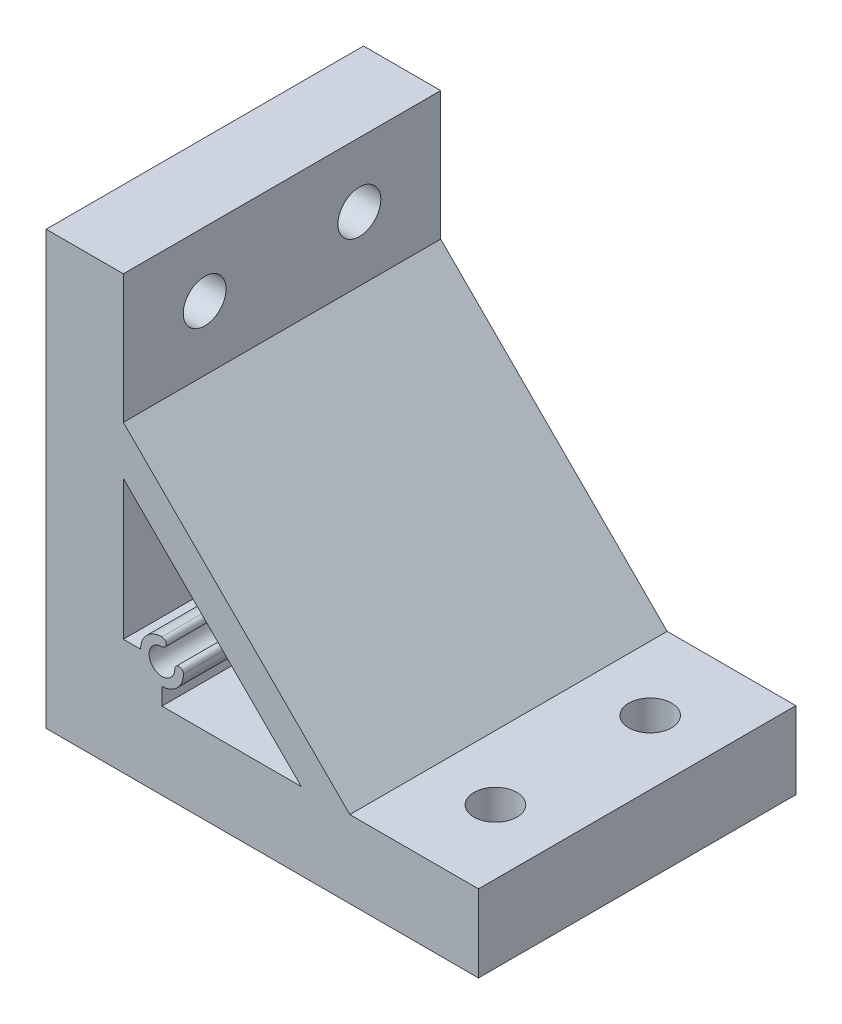
ISO-10303-21;
HEADER;
FILE_DESCRIPTION(('STEP AP214'),'2;1');
FILE_NAME('part.step','',(''),(''),'','','');
FILE_SCHEMA(('AUTOMOTIVE_DESIGN { 1 0 10303 214 1 1 1 1 }'));
ENDSEC;
DATA;
#1=APPLICATION_CONTEXT('core data for automotive mechanical design processes');
#2=APPLICATION_PROTOCOL_DEFINITION('international standard','automotive_design',2000,#1);
#3=PRODUCT_CONTEXT('',#1,'mechanical');
#4=PRODUCT('Part','Part','',(#3));
#5=PRODUCT_RELATED_PRODUCT_CATEGORY('part','',(#4));
#6=PRODUCT_DEFINITION_FORMATION('','',#4);
#7=PRODUCT_DEFINITION_CONTEXT('part definition',#1,'design');
#8=PRODUCT_DEFINITION('design','',#6,#7);
#9=PRODUCT_DEFINITION_SHAPE('','',#8);
#10=(LENGTH_UNIT() NAMED_UNIT(*) SI_UNIT(.MILLI.,.METRE.));
#11=(NAMED_UNIT(*) PLANE_ANGLE_UNIT() SI_UNIT($,.RADIAN.));
#12=(NAMED_UNIT(*) SI_UNIT($,.STERADIAN.) SOLID_ANGLE_UNIT());
#13=UNCERTAINTY_MEASURE_WITH_UNIT(LENGTH_MEASURE(1.E-05),#10,'distance_accuracy_value','');
#14=(GEOMETRIC_REPRESENTATION_CONTEXT(3) GLOBAL_UNCERTAINTY_ASSIGNED_CONTEXT((#13)) GLOBAL_UNIT_ASSIGNED_CONTEXT((#10,
#11,#12)) REPRESENTATION_CONTEXT('',''));
#15=CARTESIAN_POINT('',(0.,0.,0.));
#16=DIRECTION('',(0.,0.,1.));
#17=DIRECTION('',(1.,0.,0.));
#18=AXIS2_PLACEMENT_3D('',#15,#16,#17);
#19=CARTESIAN_POINT('',(0.,0.,37.));
#20=DIRECTION('',(-1.,0.,0.));
#21=DIRECTION('',(0.,0.,1.));
#22=AXIS2_PLACEMENT_3D('',#19,#20,#21);
#23=PLANE('',#22);
#24=CARTESIAN_POINT('',(0.,42.9020003333889,27.517));
#25=DIRECTION('',(-1.,0.,0.));
#26=DIRECTION('',(0.,0.,1.));
#27=AXIS2_PLACEMENT_3D('',#24,#25,#26);
#28=CIRCLE('',#27,2.5);
#29=CARTESIAN_POINT('',(0.,42.9020003333889,30.017));
#30=VERTEX_POINT('',#29);
#31=EDGE_CURVE('E287',#30,#30,#28,.F.);
#32=ORIENTED_EDGE('',*,*,#31,.T.);
#33=EDGE_LOOP('',(#32));
#34=FACE_BOUND('',#33,.T.);
#35=CARTESIAN_POINT('',(0.,42.9020003333889,9.483));
#36=DIRECTION('',(-1.,0.,0.));
#37=DIRECTION('',(0.,0.,1.));
#38=AXIS2_PLACEMENT_3D('',#35,#36,#37);
#39=CIRCLE('',#38,2.5);
#40=CARTESIAN_POINT('',(0.,42.9020003333889,11.983));
#41=VERTEX_POINT('',#40);
#42=EDGE_CURVE('E414',#41,#41,#39,.F.);
#43=ORIENTED_EDGE('',*,*,#42,.T.);
#44=EDGE_LOOP('',(#43));
#45=FACE_BOUND('',#44,.T.);
#46=DIRECTION('',(0.,1.,0.));
#47=VECTOR('',#46,1.);
#48=CARTESIAN_POINT('',(0.,0.,0.));
#49=LINE('',#48,#47);
#50=CARTESIAN_POINT('',(0.,0.,0.));
#51=VERTEX_POINT('',#50);
#52=CARTESIAN_POINT('',(0.,50.4020003333889,0.));
#53=VERTEX_POINT('',#52);
#54=EDGE_CURVE('E218',#51,#53,#49,.T.);
#55=ORIENTED_EDGE('',*,*,#54,.F.);
#56=DIRECTION('',(0.,0.,-1.));
#57=VECTOR('',#56,1.);
#58=CARTESIAN_POINT('',(0.,0.,37.));
#59=LINE('',#58,#57);
#60=CARTESIAN_POINT('',(0.,0.,37.));
#61=VERTEX_POINT('',#60);
#62=EDGE_CURVE('E12',#61,#51,#59,.T.);
#63=ORIENTED_EDGE('',*,*,#62,.F.);
#64=DIRECTION('',(0.,1.,0.));
#65=VECTOR('',#64,1.);
#66=CARTESIAN_POINT('',(0.,0.,37.));
#67=LINE('',#66,#65);
#68=CARTESIAN_POINT('',(0.,50.4020003333889,37.));
#69=VERTEX_POINT('',#68);
#70=EDGE_CURVE('E304',#61,#69,#67,.T.);
#71=ORIENTED_EDGE('',*,*,#70,.T.);
#72=DIRECTION('',(0.,0.,-1.));
#73=VECTOR('',#72,1.);
#74=CARTESIAN_POINT('',(0.,50.4020003333889,37.));
#75=LINE('',#74,#73);
#76=EDGE_CURVE('E98',#69,#53,#75,.T.);
#77=ORIENTED_EDGE('',*,*,#76,.T.);
#78=EDGE_LOOP('',(#55,#63,#71,#77));
#79=FACE_BOUND('',#78,.T.);
#80=ADVANCED_FACE('F79',(#34,#45,#79),#23,.T.);
#81=CARTESIAN_POINT('',(0.,0.,37.));
#82=DIRECTION('',(0.,1.,0.));
#83=DIRECTION('',(0.,0.,1.));
#84=AXIS2_PLACEMENT_3D('',#81,#82,#83);
#85=PLANE('',#84);
#86=CARTESIAN_POINT('',(42.9020003333889,0.,27.517));
#87=DIRECTION('',(0.,1.,0.));
#88=DIRECTION('',(0.,0.,1.));
#89=AXIS2_PLACEMENT_3D('',#86,#87,#88);
#90=CIRCLE('',#89,2.5);
#91=CARTESIAN_POINT('',(42.9020003333889,0.,30.017));
#92=VERTEX_POINT('',#91);
#93=EDGE_CURVE('E460',#92,#92,#90,.T.);
#94=ORIENTED_EDGE('',*,*,#93,.T.);
#95=EDGE_LOOP('',(#94));
#96=FACE_BOUND('',#95,.T.);
#97=CARTESIAN_POINT('',(42.9020003333889,0.,9.483));
#98=DIRECTION('',(0.,1.,0.));
#99=DIRECTION('',(0.,0.,1.));
#100=AXIS2_PLACEMENT_3D('',#97,#98,#99);
#101=CIRCLE('',#100,2.5);
#102=CARTESIAN_POINT('',(42.9020003333889,0.,11.983));
#103=VERTEX_POINT('',#102);
#104=EDGE_CURVE('E465',#103,#103,#101,.T.);
#105=ORIENTED_EDGE('',*,*,#104,.T.);
#106=EDGE_LOOP('',(#105));
#107=FACE_BOUND('',#106,.T.);
#108=DIRECTION('',(1.,0.,0.));
#109=VECTOR('',#108,1.);
#110=CARTESIAN_POINT('',(0.,0.,0.));
#111=LINE('',#110,#109);
#112=CARTESIAN_POINT('',(50.4020003333889,0.,0.));
#113=VERTEX_POINT('',#112);
#114=EDGE_CURVE('E220',#51,#113,#111,.T.);
#115=ORIENTED_EDGE('',*,*,#114,.T.);
#116=DIRECTION('',(0.,0.,-1.));
#117=VECTOR('',#116,1.);
#118=CARTESIAN_POINT('',(50.4020003333889,0.,37.));
#119=LINE('',#118,#117);
#120=CARTESIAN_POINT('',(50.4020003333889,0.,37.));
#121=VERTEX_POINT('',#120);
#122=EDGE_CURVE('E89',#121,#113,#119,.T.);
#123=ORIENTED_EDGE('',*,*,#122,.F.);
#124=DIRECTION('',(1.,0.,0.));
#125=VECTOR('',#124,1.);
#126=CARTESIAN_POINT('',(0.,0.,37.));
#127=LINE('',#126,#125);
#128=EDGE_CURVE('E306',#61,#121,#127,.T.);
#129=ORIENTED_EDGE('',*,*,#128,.F.);
#130=ORIENTED_EDGE('',*,*,#62,.T.);
#131=EDGE_LOOP('',(#115,#123,#129,#130));
#132=FACE_BOUND('',#131,.T.);
#133=ADVANCED_FACE('F335',(#96,#107,#132),#85,.F.);
#134=CARTESIAN_POINT('',(50.4020003333889,0.,37.));
#135=DIRECTION('',(-1.,0.,0.));
#136=DIRECTION('',(0.,0.,1.));
#137=AXIS2_PLACEMENT_3D('',#134,#135,#136);
#138=PLANE('',#137);
#139=DIRECTION('',(0.,1.,0.));
#140=VECTOR('',#139,1.);
#141=CARTESIAN_POINT('',(50.4020003333889,0.,0.));
#142=LINE('',#141,#140);
#143=CARTESIAN_POINT('',(50.4020003333889,9.,0.));
#144=VERTEX_POINT('',#143);
#145=EDGE_CURVE('E223',#113,#144,#142,.T.);
#146=ORIENTED_EDGE('',*,*,#145,.T.);
#147=DIRECTION('',(0.,0.,-1.));
#148=VECTOR('',#147,1.);
#149=CARTESIAN_POINT('',(50.4020003333889,9.,37.));
#150=LINE('',#149,#148);
#151=CARTESIAN_POINT('',(50.4020003333889,9.,37.));
#152=VERTEX_POINT('',#151);
#153=EDGE_CURVE('E239',#152,#144,#150,.T.);
#154=ORIENTED_EDGE('',*,*,#153,.F.);
#155=DIRECTION('',(0.,1.,0.));
#156=VECTOR('',#155,1.);
#157=CARTESIAN_POINT('',(50.4020003333889,0.,37.));
#158=LINE('',#157,#156);
#159=EDGE_CURVE('E309',#121,#152,#158,.T.);
#160=ORIENTED_EDGE('',*,*,#159,.F.);
#161=ORIENTED_EDGE('',*,*,#122,.T.);
#162=EDGE_LOOP('',(#146,#154,#160,#161));
#163=FACE_BOUND('',#162,.T.);
#164=ADVANCED_FACE('F314',(#163),#138,.F.);
#165=CARTESIAN_POINT('',(0.,9.,37.));
#166=DIRECTION('',(0.,-1.,0.));
#167=DIRECTION('',(0.,0.,-1.));
#168=AXIS2_PLACEMENT_3D('',#165,#166,#167);
#169=PLANE('',#168);
#170=CARTESIAN_POINT('',(42.902000333389,8.99999999999985,27.517));
#171=DIRECTION('',(0.,-1.,0.));
#172=DIRECTION('',(1.,0.,0.));
#173=AXIS2_PLACEMENT_3D('',#170,#171,#172);
#174=CIRCLE('',#173,2.5);
#175=CARTESIAN_POINT('',(45.402000333389,8.99999999999984,27.517));
#176=VERTEX_POINT('',#175);
#177=EDGE_CURVE('E457',#176,#176,#174,.T.);
#178=ORIENTED_EDGE('',*,*,#177,.T.);
#179=EDGE_LOOP('',(#178));
#180=FACE_BOUND('',#179,.T.);
#181=CARTESIAN_POINT('',(42.902000333389,8.99999999999985,9.483));
#182=DIRECTION('',(0.,-1.,0.));
#183=DIRECTION('',(1.,0.,0.));
#184=AXIS2_PLACEMENT_3D('',#181,#182,#183);
#185=CIRCLE('',#184,2.5);
#186=CARTESIAN_POINT('',(45.402000333389,8.99999999999984,9.483));
#187=VERTEX_POINT('',#186);
#188=EDGE_CURVE('E461',#187,#187,#185,.T.);
#189=ORIENTED_EDGE('',*,*,#188,.T.);
#190=EDGE_LOOP('',(#189));
#191=FACE_BOUND('',#190,.T.);
#192=DIRECTION('',(-1.,0.,0.));
#193=VECTOR('',#192,1.);
#194=CARTESIAN_POINT('',(0.,9.,0.));
#195=LINE('',#194,#193);
#196=CARTESIAN_POINT('',(35.4020003333889,9.,0.));
#197=VERTEX_POINT('',#196);
#198=EDGE_CURVE('E226',#144,#197,#195,.T.);
#199=ORIENTED_EDGE('',*,*,#198,.T.);
#200=DIRECTION('',(0.,0.,-1.));
#201=VECTOR('',#200,1.);
#202=CARTESIAN_POINT('',(35.4020003333889,9.,37.));
#203=LINE('',#202,#201);
#204=CARTESIAN_POINT('',(35.4020003333889,9.,37.));
#205=VERTEX_POINT('',#204);
#206=EDGE_CURVE('E185',#205,#197,#203,.T.);
#207=ORIENTED_EDGE('',*,*,#206,.F.);
#208=DIRECTION('',(-1.,0.,0.));
#209=VECTOR('',#208,1.);
#210=CARTESIAN_POINT('',(0.,9.,37.));
#211=LINE('',#210,#209);
#212=EDGE_CURVE('E194',#152,#205,#211,.T.);
#213=ORIENTED_EDGE('',*,*,#212,.F.);
#214=ORIENTED_EDGE('',*,*,#153,.T.);
#215=EDGE_LOOP('',(#199,#207,#213,#214));
#216=FACE_BOUND('',#215,.T.);
#217=ADVANCED_FACE('F316',(#180,#191,#216),#169,.F.);
#218=CARTESIAN_POINT('',(22.2010001666945,22.2010001666945,37.));
#219=DIRECTION('',(0.707106781186547,0.707106781186547,0.));
#220=DIRECTION('',(-0.707106781186548,0.707106781186548,0.));
#221=AXIS2_PLACEMENT_3D('',#218,#219,#220);
#222=PLANE('',#221);
#223=DIRECTION('',(0.707106781186548,-0.707106781186548,0.));
#224=VECTOR('',#223,1.);
#225=CARTESIAN_POINT('',(22.2010001666945,22.2010001666945,0.));
#226=LINE('',#225,#224);
#227=CARTESIAN_POINT('',(9.,35.4020003333889,0.));
#228=VERTEX_POINT('',#227);
#229=EDGE_CURVE('E181',#228,#197,#226,.T.);
#230=ORIENTED_EDGE('',*,*,#229,.F.);
#231=DIRECTION('',(0.,0.,-1.));
#232=VECTOR('',#231,1.);
#233=CARTESIAN_POINT('',(9.,35.4020003333889,37.));
#234=LINE('',#233,#232);
#235=CARTESIAN_POINT('',(9.,35.4020003333889,37.));
#236=VERTEX_POINT('',#235);
#237=EDGE_CURVE('E176',#236,#228,#234,.T.);
#238=ORIENTED_EDGE('',*,*,#237,.F.);
#239=DIRECTION('',(0.707106781186548,-0.707106781186548,0.));
#240=VECTOR('',#239,1.);
#241=CARTESIAN_POINT('',(22.2010001666945,22.2010001666945,37.));
#242=LINE('',#241,#240);
#243=EDGE_CURVE('E179',#236,#205,#242,.T.);
#244=ORIENTED_EDGE('',*,*,#243,.T.);
#245=ORIENTED_EDGE('',*,*,#206,.T.);
#246=EDGE_LOOP('',(#230,#238,#244,#245));
#247=FACE_BOUND('',#246,.T.);
#248=ADVANCED_FACE('F178',(#247),#222,.T.);
#249=CARTESIAN_POINT('',(9.00000000000001,0.,37.));
#250=DIRECTION('',(1.,0.,0.));
#251=DIRECTION('',(0.,1.,0.));
#252=AXIS2_PLACEMENT_3D('',#249,#250,#251);
#253=PLANE('',#252);
#254=CARTESIAN_POINT('',(9.,42.9020003333889,27.517));
#255=DIRECTION('',(1.,0.,0.));
#256=DIRECTION('',(0.,1.,0.));
#257=AXIS2_PLACEMENT_3D('',#254,#255,#256);
#258=CIRCLE('',#257,2.5);
#259=CARTESIAN_POINT('',(9.,45.4020003333889,27.517));
#260=VERTEX_POINT('',#259);
#261=EDGE_CURVE('E282',#260,#260,#258,.T.);
#262=ORIENTED_EDGE('',*,*,#261,.F.);
#263=EDGE_LOOP('',(#262));
#264=FACE_BOUND('',#263,.T.);
#265=CARTESIAN_POINT('',(9.,42.9020003333889,9.483));
#266=DIRECTION('',(1.,0.,0.));
#267=DIRECTION('',(0.,1.,0.));
#268=AXIS2_PLACEMENT_3D('',#265,#266,#267);
#269=CIRCLE('',#268,2.5);
#270=CARTESIAN_POINT('',(9.,45.4020003333889,9.483));
#271=VERTEX_POINT('',#270);
#272=EDGE_CURVE('E470',#271,#271,#269,.T.);
#273=ORIENTED_EDGE('',*,*,#272,.F.);
#274=EDGE_LOOP('',(#273));
#275=FACE_BOUND('',#274,.T.);
#276=DIRECTION('',(0.,-1.,0.));
#277=VECTOR('',#276,1.);
#278=CARTESIAN_POINT('',(9.00000000000001,0.,0.));
#279=LINE('',#278,#277);
#280=CARTESIAN_POINT('',(9.,50.4020003333889,0.));
#281=VERTEX_POINT('',#280);
#282=EDGE_CURVE('E230',#281,#228,#279,.T.);
#283=ORIENTED_EDGE('',*,*,#282,.F.);
#284=DIRECTION('',(0.,0.,-1.));
#285=VECTOR('',#284,1.);
#286=CARTESIAN_POINT('',(9.,50.4020003333889,37.));
#287=LINE('',#286,#285);
#288=CARTESIAN_POINT('',(9.,50.4020003333889,37.));
#289=VERTEX_POINT('',#288);
#290=EDGE_CURVE('E136',#289,#281,#287,.T.);
#291=ORIENTED_EDGE('',*,*,#290,.F.);
#292=DIRECTION('',(0.,-1.,0.));
#293=VECTOR('',#292,1.);
#294=CARTESIAN_POINT('',(9.00000000000001,0.,37.));
#295=LINE('',#294,#293);
#296=EDGE_CURVE('E192',#289,#236,#295,.T.);
#297=ORIENTED_EDGE('',*,*,#296,.T.);
#298=ORIENTED_EDGE('',*,*,#237,.T.);
#299=EDGE_LOOP('',(#283,#291,#297,#298));
#300=FACE_BOUND('',#299,.T.);
#301=ADVANCED_FACE('F197',(#264,#275,#300),#253,.T.);
#302=CARTESIAN_POINT('',(13.5,0.,37.));
#303=DIRECTION('',(-1.,0.,0.));
#304=DIRECTION('',(0.,0.,1.));
#305=AXIS2_PLACEMENT_3D('',#302,#303,#304);
#306=PLANE('',#305);
#307=DIRECTION('',(0.,1.,0.));
#308=VECTOR('',#307,1.);
#309=CARTESIAN_POINT('',(13.5,0.,0.));
#310=LINE('',#309,#308);
#311=CARTESIAN_POINT('',(13.5,9.,0.));
#312=VERTEX_POINT('',#311);
#313=CARTESIAN_POINT('',(13.5,11.,0.));
#314=VERTEX_POINT('',#313);
#315=EDGE_CURVE('E204',#312,#314,#310,.T.);
#316=ORIENTED_EDGE('',*,*,#315,.T.);
#317=DIRECTION('',(0.,0.,-1.));
#318=VECTOR('',#317,1.);
#319=CARTESIAN_POINT('',(13.5,11.,37.));
#320=LINE('',#319,#318);
#321=CARTESIAN_POINT('',(13.5,11.,37.));
#322=VERTEX_POINT('',#321);
#323=EDGE_CURVE('E83',#322,#314,#320,.T.);
#324=ORIENTED_EDGE('',*,*,#323,.F.);
#325=DIRECTION('',(0.,1.,0.));
#326=VECTOR('',#325,1.);
#327=CARTESIAN_POINT('',(13.5,0.,37.));
#328=LINE('',#327,#326);
#329=CARTESIAN_POINT('',(13.5,9.,37.));
#330=VERTEX_POINT('',#329);
#331=EDGE_CURVE('E235',#330,#322,#328,.T.);
#332=ORIENTED_EDGE('',*,*,#331,.F.);
#333=DIRECTION('',(0.,0.,-1.));
#334=VECTOR('',#333,1.);
#335=CARTESIAN_POINT('',(13.5,9.,37.));
#336=LINE('',#335,#334);
#337=EDGE_CURVE('E200',#330,#312,#336,.T.);
#338=ORIENTED_EDGE('',*,*,#337,.T.);
#339=EDGE_LOOP('',(#316,#324,#332,#338));
#340=FACE_BOUND('',#339,.T.);
#341=ADVANCED_FACE('F81',(#340),#306,.F.);
#342=CARTESIAN_POINT('',(0.,13.5,37.));
#343=DIRECTION('',(0.,1.,0.));
#344=DIRECTION('',(0.,0.,1.));
#345=AXIS2_PLACEMENT_3D('',#342,#343,#344);
#346=PLANE('',#345);
#347=DIRECTION('',(1.,0.,0.));
#348=VECTOR('',#347,1.);
#349=CARTESIAN_POINT('',(0.,13.5,0.));
#350=LINE('',#349,#348);
#351=CARTESIAN_POINT('',(9.,13.5,0.));
#352=VERTEX_POINT('',#351);
#353=CARTESIAN_POINT('',(11.,13.5,0.));
#354=VERTEX_POINT('',#353);
#355=EDGE_CURVE('E207',#352,#354,#350,.T.);
#356=ORIENTED_EDGE('',*,*,#355,.F.);
#357=DIRECTION('',(0.,0.,-1.));
#358=VECTOR('',#357,1.);
#359=CARTESIAN_POINT('',(9.,13.5,37.));
#360=LINE('',#359,#358);
#361=CARTESIAN_POINT('',(9.,13.5,37.));
#362=VERTEX_POINT('',#361);
#363=EDGE_CURVE('E148',#362,#352,#360,.T.);
#364=ORIENTED_EDGE('',*,*,#363,.F.);
#365=DIRECTION('',(1.,0.,0.));
#366=VECTOR('',#365,1.);
#367=CARTESIAN_POINT('',(0.,13.5,37.));
#368=LINE('',#367,#366);
#369=CARTESIAN_POINT('',(11.,13.5,37.));
#370=VERTEX_POINT('',#369);
#371=EDGE_CURVE('E295',#362,#370,#368,.T.);
#372=ORIENTED_EDGE('',*,*,#371,.T.);
#373=DIRECTION('',(0.,0.,-1.));
#374=VECTOR('',#373,1.);
#375=CARTESIAN_POINT('',(11.,13.5,37.));
#376=LINE('',#375,#374);
#377=EDGE_CURVE('E251',#370,#354,#376,.T.);
#378=ORIENTED_EDGE('',*,*,#377,.T.);
#379=EDGE_LOOP('',(#356,#364,#372,#378));
#380=FACE_BOUND('',#379,.T.);
#381=ADVANCED_FACE('F354',(#380),#346,.T.);
#382=CARTESIAN_POINT('',(9.,0.,37.));
#383=DIRECTION('',(1.,0.,0.));
#384=DIRECTION('',(0.,1.,0.));
#385=AXIS2_PLACEMENT_3D('',#382,#383,#384);
#386=PLANE('',#385);
#387=DIRECTION('',(0.,-1.,0.));
#388=VECTOR('',#387,1.);
#389=CARTESIAN_POINT('',(9.,0.,0.));
#390=LINE('',#389,#388);
#391=CARTESIAN_POINT('',(9.,29.7451460838966,0.));
#392=VERTEX_POINT('',#391);
#393=EDGE_CURVE('E211',#392,#352,#390,.T.);
#394=ORIENTED_EDGE('',*,*,#393,.F.);
#395=DIRECTION('',(0.,0.,-1.));
#396=VECTOR('',#395,1.);
#397=CARTESIAN_POINT('',(9.,29.7451460838966,37.));
#398=LINE('',#397,#396);
#399=CARTESIAN_POINT('',(9.,29.7451460838966,37.));
#400=VERTEX_POINT('',#399);
#401=EDGE_CURVE('E249',#400,#392,#398,.T.);
#402=ORIENTED_EDGE('',*,*,#401,.F.);
#403=DIRECTION('',(0.,-1.,0.));
#404=VECTOR('',#403,1.);
#405=CARTESIAN_POINT('',(9.,0.,37.));
#406=LINE('',#405,#404);
#407=EDGE_CURVE('E297',#400,#362,#406,.T.);
#408=ORIENTED_EDGE('',*,*,#407,.T.);
#409=ORIENTED_EDGE('',*,*,#363,.T.);
#410=EDGE_LOOP('',(#394,#402,#408,#409));
#411=FACE_BOUND('',#410,.T.);
#412=ADVANCED_FACE('F351',(#411),#386,.T.);
#413=CARTESIAN_POINT('',(19.3725730419483,19.3725730419483,37.));
#414=DIRECTION('',(0.707106781186547,0.707106781186547,0.));
#415=DIRECTION('',(-0.707106781186548,0.707106781186548,0.));
#416=AXIS2_PLACEMENT_3D('',#413,#414,#415);
#417=PLANE('',#416);
#418=DIRECTION('',(0.707106781186548,-0.707106781186548,0.));
#419=VECTOR('',#418,1.);
#420=CARTESIAN_POINT('',(19.3725730419483,19.3725730419483,0.));
#421=LINE('',#420,#419);
#422=CARTESIAN_POINT('',(29.7451460838966,9.,0.));
#423=VERTEX_POINT('',#422);
#424=EDGE_CURVE('E214',#392,#423,#421,.T.);
#425=ORIENTED_EDGE('',*,*,#424,.T.);
#426=DIRECTION('',(0.,0.,-1.));
#427=VECTOR('',#426,1.);
#428=CARTESIAN_POINT('',(29.7451460838966,9.,37.));
#429=LINE('',#428,#427);
#430=CARTESIAN_POINT('',(29.7451460838966,9.,37.));
#431=VERTEX_POINT('',#430);
#432=EDGE_CURVE('E246',#431,#423,#429,.T.);
#433=ORIENTED_EDGE('',*,*,#432,.F.);
#434=DIRECTION('',(0.707106781186548,-0.707106781186548,0.));
#435=VECTOR('',#434,1.);
#436=CARTESIAN_POINT('',(19.3725730419483,19.3725730419483,37.));
#437=LINE('',#436,#435);
#438=EDGE_CURVE('E300',#400,#431,#437,.T.);
#439=ORIENTED_EDGE('',*,*,#438,.F.);
#440=ORIENTED_EDGE('',*,*,#401,.T.);
#441=EDGE_LOOP('',(#425,#433,#439,#440));
#442=FACE_BOUND('',#441,.T.);
#443=ADVANCED_FACE('F329',(#442),#417,.F.);
#444=CARTESIAN_POINT('',(0.,9.,37.));
#445=DIRECTION('',(0.,-1.,0.));
#446=DIRECTION('',(1.,0.,0.));
#447=AXIS2_PLACEMENT_3D('',#444,#445,#446);
#448=PLANE('',#447);
#449=DIRECTION('',(-1.,0.,0.));
#450=VECTOR('',#449,1.);
#451=CARTESIAN_POINT('',(0.,9.,0.));
#452=LINE('',#451,#450);
#453=EDGE_CURVE('E216',#423,#312,#452,.T.);
#454=ORIENTED_EDGE('',*,*,#453,.T.);
#455=ORIENTED_EDGE('',*,*,#337,.F.);
#456=DIRECTION('',(-1.,0.,0.));
#457=VECTOR('',#456,1.);
#458=CARTESIAN_POINT('',(0.,9.,37.));
#459=LINE('',#458,#457);
#460=EDGE_CURVE('E302',#431,#330,#459,.T.);
#461=ORIENTED_EDGE('',*,*,#460,.F.);
#462=ORIENTED_EDGE('',*,*,#432,.T.);
#463=EDGE_LOOP('',(#454,#455,#461,#462));
#464=FACE_BOUND('',#463,.T.);
#465=ADVANCED_FACE('F320',(#464),#448,.F.);
#466=CARTESIAN_POINT('',(0.,50.4020003333889,37.));
#467=DIRECTION('',(0.,1.,0.));
#468=DIRECTION('',(0.,0.,1.));
#469=AXIS2_PLACEMENT_3D('',#466,#467,#468);
#470=PLANE('',#469);
#471=DIRECTION('',(1.,0.,0.));
#472=VECTOR('',#471,1.);
#473=CARTESIAN_POINT('',(0.,50.4020003333889,0.));
#474=LINE('',#473,#472);
#475=EDGE_CURVE('E232',#53,#281,#474,.T.);
#476=ORIENTED_EDGE('',*,*,#475,.F.);
#477=ORIENTED_EDGE('',*,*,#76,.F.);
#478=DIRECTION('',(1.,0.,0.));
#479=VECTOR('',#478,1.);
#480=CARTESIAN_POINT('',(0.,50.4020003333889,37.));
#481=LINE('',#480,#479);
#482=EDGE_CURVE('E198',#69,#289,#481,.T.);
#483=ORIENTED_EDGE('',*,*,#482,.T.);
#484=ORIENTED_EDGE('',*,*,#290,.T.);
#485=EDGE_LOOP('',(#476,#477,#483,#484));
#486=FACE_BOUND('',#485,.T.);
#487=ADVANCED_FACE('F318',(#486),#470,.T.);
#488=CARTESIAN_POINT('',(0.,0.,37.));
#489=DIRECTION('',(0.,0.,1.));
#490=DIRECTION('',(1.,0.,0.));
#491=AXIS2_PLACEMENT_3D('',#488,#489,#490);
#492=PLANE('',#491);
#493=ORIENTED_EDGE('',*,*,#331,.T.);
#494=CARTESIAN_POINT('',(13.5,13.5,37.));
#495=DIRECTION('',(0.,0.,1.));
#496=DIRECTION('',(1.,0.,0.));
#497=AXIS2_PLACEMENT_3D('',#494,#495,#496);
#498=CIRCLE('',#497,2.5);
#499=CARTESIAN_POINT('',(16.,13.5,37.));
#500=VERTEX_POINT('',#499);
#501=EDGE_CURVE('E266',#322,#500,#498,.T.);
#502=ORIENTED_EDGE('',*,*,#501,.T.);
#503=CARTESIAN_POINT('',(15.5,13.5,37.));
#504=DIRECTION('',(0.,0.,1.));
#505=DIRECTION('',(1.,0.,0.));
#506=AXIS2_PLACEMENT_3D('',#503,#504,#505);
#507=CIRCLE('',#506,0.499999999999998);
#508=CARTESIAN_POINT('',(15.,13.5,37.));
#509=VERTEX_POINT('',#508);
#510=EDGE_CURVE('E406',#500,#509,#507,.T.);
#511=ORIENTED_EDGE('',*,*,#510,.T.);
#512=CARTESIAN_POINT('',(13.5,13.5,37.));
#513=DIRECTION('',(0.,0.,1.));
#514=DIRECTION('',(1.,0.,0.));
#515=AXIS2_PLACEMENT_3D('',#512,#513,#514);
#516=CIRCLE('',#515,1.5);
#517=CARTESIAN_POINT('',(13.5,15.,37.));
#518=VERTEX_POINT('',#517);
#519=EDGE_CURVE('E291',#518,#509,#516,.T.);
#520=ORIENTED_EDGE('',*,*,#519,.F.);
#521=CARTESIAN_POINT('',(13.5,15.5,37.));
#522=DIRECTION('',(0.,0.,1.));
#523=DIRECTION('',(1.,0.,0.));
#524=AXIS2_PLACEMENT_3D('',#521,#522,#523);
#525=CIRCLE('',#524,0.499999999999999);
#526=CARTESIAN_POINT('',(13.5,16.,37.));
#527=VERTEX_POINT('',#526);
#528=EDGE_CURVE('E404',#518,#527,#525,.T.);
#529=ORIENTED_EDGE('',*,*,#528,.T.);
#530=EDGE_CURVE('E368',#527,#370,#498,.T.);
#531=ORIENTED_EDGE('',*,*,#530,.T.);
#532=ORIENTED_EDGE('',*,*,#371,.F.);
#533=ORIENTED_EDGE('',*,*,#407,.F.);
#534=ORIENTED_EDGE('',*,*,#438,.T.);
#535=ORIENTED_EDGE('',*,*,#460,.T.);
#536=EDGE_LOOP('',(#493,#502,#511,#520,#529,#531,#532,#533,#534,#535));
#537=FACE_BOUND('',#536,.T.);
#538=ORIENTED_EDGE('',*,*,#70,.F.);
#539=ORIENTED_EDGE('',*,*,#128,.T.);
#540=ORIENTED_EDGE('',*,*,#159,.T.);
#541=ORIENTED_EDGE('',*,*,#212,.T.);
#542=ORIENTED_EDGE('',*,*,#243,.F.);
#543=ORIENTED_EDGE('',*,*,#296,.F.);
#544=ORIENTED_EDGE('',*,*,#482,.F.);
#545=EDGE_LOOP('',(#538,#539,#540,#541,#542,#543,#544));
#546=FACE_BOUND('',#545,.T.);
#547=ADVANCED_FACE('F190',(#537,#546),#492,.T.);
#548=CARTESIAN_POINT('',(0.,0.,0.));
#549=DIRECTION('',(0.,0.,1.));
#550=DIRECTION('',(1.,0.,0.));
#551=AXIS2_PLACEMENT_3D('',#548,#549,#550);
#552=PLANE('',#551);
#553=ORIENTED_EDGE('',*,*,#315,.F.);
#554=ORIENTED_EDGE('',*,*,#453,.F.);
#555=ORIENTED_EDGE('',*,*,#424,.F.);
#556=ORIENTED_EDGE('',*,*,#393,.T.);
#557=ORIENTED_EDGE('',*,*,#355,.T.);
#558=CARTESIAN_POINT('',(13.5,13.5,0.));
#559=DIRECTION('',(0.,0.,1.));
#560=DIRECTION('',(1.,0.,0.));
#561=AXIS2_PLACEMENT_3D('',#558,#559,#560);
#562=CIRCLE('',#561,2.5);
#563=CARTESIAN_POINT('',(13.5,16.,0.));
#564=VERTEX_POINT('',#563);
#565=EDGE_CURVE('E281',#564,#354,#562,.T.);
#566=ORIENTED_EDGE('',*,*,#565,.F.);
#567=CARTESIAN_POINT('',(13.5,15.5,0.));
#568=DIRECTION('',(0.,0.,1.));
#569=DIRECTION('',(1.,0.,0.));
#570=AXIS2_PLACEMENT_3D('',#567,#568,#569);
#571=CIRCLE('',#570,0.499999999999999);
#572=CARTESIAN_POINT('',(13.5,15.,0.));
#573=VERTEX_POINT('',#572);
#574=EDGE_CURVE('E408',#573,#564,#571,.T.);
#575=ORIENTED_EDGE('',*,*,#574,.F.);
#576=CARTESIAN_POINT('',(13.5,13.5,0.));
#577=DIRECTION('',(0.,0.,1.));
#578=DIRECTION('',(1.,0.,0.));
#579=AXIS2_PLACEMENT_3D('',#576,#577,#578);
#580=CIRCLE('',#579,1.5);
#581=CARTESIAN_POINT('',(15.,13.5,0.));
#582=VERTEX_POINT('',#581);
#583=EDGE_CURVE('E285',#573,#582,#580,.T.);
#584=ORIENTED_EDGE('',*,*,#583,.T.);
#585=CARTESIAN_POINT('',(15.5,13.5,0.));
#586=DIRECTION('',(0.,0.,1.));
#587=DIRECTION('',(1.,0.,0.));
#588=AXIS2_PLACEMENT_3D('',#585,#586,#587);
#589=CIRCLE('',#588,0.499999999999998);
#590=CARTESIAN_POINT('',(16.,13.5,0.));
#591=VERTEX_POINT('',#590);
#592=EDGE_CURVE('E280',#591,#582,#589,.T.);
#593=ORIENTED_EDGE('',*,*,#592,.F.);
#594=EDGE_CURVE('E263',#314,#591,#562,.T.);
#595=ORIENTED_EDGE('',*,*,#594,.F.);
#596=EDGE_LOOP('',(#553,#554,#555,#556,#557,#566,#575,#584,#593,#595));
#597=FACE_BOUND('',#596,.T.);
#598=ORIENTED_EDGE('',*,*,#54,.T.);
#599=ORIENTED_EDGE('',*,*,#475,.T.);
#600=ORIENTED_EDGE('',*,*,#282,.T.);
#601=ORIENTED_EDGE('',*,*,#229,.T.);
#602=ORIENTED_EDGE('',*,*,#198,.F.);
#603=ORIENTED_EDGE('',*,*,#145,.F.);
#604=ORIENTED_EDGE('',*,*,#114,.F.);
#605=EDGE_LOOP('',(#598,#599,#600,#601,#602,#603,#604));
#606=FACE_BOUND('',#605,.T.);
#607=ADVANCED_FACE('F274',(#597,#606),#552,.F.);
#608=CARTESIAN_POINT('',(13.5,13.5,37.));
#609=DIRECTION('',(0.,0.,-1.));
#610=DIRECTION('',(-1.,0.,0.));
#611=AXIS2_PLACEMENT_3D('',#608,#609,#610);
#612=CYLINDRICAL_SURFACE('',#611,2.5);
#613=ORIENTED_EDGE('',*,*,#501,.F.);
#614=ORIENTED_EDGE('',*,*,#323,.T.);
#615=ORIENTED_EDGE('',*,*,#594,.T.);
#616=DIRECTION('',(0.,0.,-1.));
#617=VECTOR('',#616,1.);
#618=CARTESIAN_POINT('',(16.,13.5,37.));
#619=LINE('',#618,#617);
#620=EDGE_CURVE('E411',#500,#591,#619,.T.);
#621=ORIENTED_EDGE('',*,*,#620,.F.);
#622=EDGE_LOOP('',(#613,#614,#615,#621));
#623=FACE_BOUND('',#622,.T.);
#624=ADVANCED_FACE('F260',(#623),#612,.T.);
#625=CARTESIAN_POINT('',(13.5,15.5,37.));
#626=DIRECTION('',(0.,0.,-1.));
#627=DIRECTION('',(-1.,0.,0.));
#628=AXIS2_PLACEMENT_3D('',#625,#626,#627);
#629=CYLINDRICAL_SURFACE('',#628,0.499999999999999);
#630=ORIENTED_EDGE('',*,*,#574,.T.);
#631=DIRECTION('',(0.,0.,-1.));
#632=VECTOR('',#631,1.);
#633=CARTESIAN_POINT('',(13.5,16.,37.));
#634=LINE('',#633,#632);
#635=EDGE_CURVE('E402',#527,#564,#634,.T.);
#636=ORIENTED_EDGE('',*,*,#635,.F.);
#637=ORIENTED_EDGE('',*,*,#528,.F.);
#638=DIRECTION('',(0.,0.,-1.));
#639=VECTOR('',#638,1.);
#640=CARTESIAN_POINT('',(13.5,15.,37.));
#641=LINE('',#640,#639);
#642=EDGE_CURVE('E208',#518,#573,#641,.T.);
#643=ORIENTED_EDGE('',*,*,#642,.T.);
#644=EDGE_LOOP('',(#630,#636,#637,#643));
#645=FACE_BOUND('',#644,.T.);
#646=ADVANCED_FACE('F407',(#645),#629,.T.);
#647=CARTESIAN_POINT('',(15.5,13.5,37.));
#648=DIRECTION('',(0.,0.,-1.));
#649=DIRECTION('',(-1.,0.,0.));
#650=AXIS2_PLACEMENT_3D('',#647,#648,#649);
#651=CYLINDRICAL_SURFACE('',#650,0.499999999999998);
#652=ORIENTED_EDGE('',*,*,#592,.T.);
#653=DIRECTION('',(0.,0.,-1.));
#654=VECTOR('',#653,1.);
#655=CARTESIAN_POINT('',(15.,13.5,37.));
#656=LINE('',#655,#654);
#657=EDGE_CURVE('E418',#509,#582,#656,.T.);
#658=ORIENTED_EDGE('',*,*,#657,.F.);
#659=ORIENTED_EDGE('',*,*,#510,.F.);
#660=ORIENTED_EDGE('',*,*,#620,.T.);
#661=EDGE_LOOP('',(#652,#658,#659,#660));
#662=FACE_BOUND('',#661,.T.);
#663=ADVANCED_FACE('F422',(#662),#651,.T.);
#664=ORIENTED_EDGE('',*,*,#377,.F.);
#665=ORIENTED_EDGE('',*,*,#530,.F.);
#666=ORIENTED_EDGE('',*,*,#635,.T.);
#667=ORIENTED_EDGE('',*,*,#565,.T.);
#668=EDGE_LOOP('',(#664,#665,#666,#667));
#669=FACE_BOUND('',#668,.T.);
#670=ADVANCED_FACE('F423',(#669),#612,.T.);
#671=CARTESIAN_POINT('',(13.5,13.5,37.));
#672=DIRECTION('',(0.,0.,-1.));
#673=DIRECTION('',(-1.,0.,0.));
#674=AXIS2_PLACEMENT_3D('',#671,#672,#673);
#675=CYLINDRICAL_SURFACE('',#674,1.5);
#676=ORIENTED_EDGE('',*,*,#583,.F.);
#677=ORIENTED_EDGE('',*,*,#642,.F.);
#678=ORIENTED_EDGE('',*,*,#519,.T.);
#679=ORIENTED_EDGE('',*,*,#657,.T.);
#680=EDGE_LOOP('',(#676,#677,#678,#679));
#681=FACE_BOUND('',#680,.T.);
#682=ADVANCED_FACE('F396',(#681),#675,.F.);
#683=CARTESIAN_POINT('',(-0.00100000000000447,42.9020003333889,9.483));
#684=DIRECTION('',(1.,0.,0.));
#685=DIRECTION('',(0.,1.,0.));
#686=AXIS2_PLACEMENT_3D('',#683,#684,#685);
#687=CYLINDRICAL_SURFACE('',#686,2.5);
#688=ORIENTED_EDGE('',*,*,#42,.F.);
#689=EDGE_LOOP('',(#688));
#690=FACE_BOUND('',#689,.T.);
#691=ORIENTED_EDGE('',*,*,#272,.T.);
#692=EDGE_LOOP('',(#691));
#693=FACE_BOUND('',#692,.T.);
#694=ADVANCED_FACE('F429',(#690,#693),#687,.F.);
#695=CARTESIAN_POINT('',(-0.00100000000000447,42.9020003333889,27.517));
#696=DIRECTION('',(1.,0.,0.));
#697=DIRECTION('',(0.,1.,0.));
#698=AXIS2_PLACEMENT_3D('',#695,#696,#697);
#699=CYLINDRICAL_SURFACE('',#698,2.5);
#700=ORIENTED_EDGE('',*,*,#31,.F.);
#701=EDGE_LOOP('',(#700));
#702=FACE_BOUND('',#701,.T.);
#703=ORIENTED_EDGE('',*,*,#261,.T.);
#704=EDGE_LOOP('',(#703));
#705=FACE_BOUND('',#704,.T.);
#706=ADVANCED_FACE('F440',(#702,#705),#699,.F.);
#707=CARTESIAN_POINT('',(42.9020003333889,-0.00100000000014672,9.483));
#708=DIRECTION('',(0.,1.,0.));
#709=DIRECTION('',(-1.,0.,0.));
#710=AXIS2_PLACEMENT_3D('',#707,#708,#709);
#711=CYLINDRICAL_SURFACE('',#710,2.5);
#712=ORIENTED_EDGE('',*,*,#188,.F.);
#713=EDGE_LOOP('',(#712));
#714=FACE_BOUND('',#713,.T.);
#715=ORIENTED_EDGE('',*,*,#104,.F.);
#716=EDGE_LOOP('',(#715));
#717=FACE_BOUND('',#716,.T.);
#718=ADVANCED_FACE('F444',(#714,#717),#711,.F.);
#719=CARTESIAN_POINT('',(42.9020003333889,-0.00100000000014672,27.517));
#720=DIRECTION('',(0.,1.,0.));
#721=DIRECTION('',(-1.,0.,0.));
#722=AXIS2_PLACEMENT_3D('',#719,#720,#721);
#723=CYLINDRICAL_SURFACE('',#722,2.5);
#724=ORIENTED_EDGE('',*,*,#177,.F.);
#725=EDGE_LOOP('',(#724));
#726=FACE_BOUND('',#725,.T.);
#727=ORIENTED_EDGE('',*,*,#93,.F.);
#728=EDGE_LOOP('',(#727));
#729=FACE_BOUND('',#728,.T.);
#730=ADVANCED_FACE('F448',(#726,#729),#723,.F.);
#731=CLOSED_SHELL('',(#80,#133,#164,#217,#248,#301,#341,#381,#412,#443,#465,#487,#547,#607,#624,
#646,#663,#670,#682,#694,#706,#718,#730));
#732=MANIFOLD_SOLID_BREP('B2',#731);
#733=ADVANCED_BREP_SHAPE_REPRESENTATION('',(#18,#732),#14);
#734=SHAPE_DEFINITION_REPRESENTATION(#9,#733);
ENDSEC;
END-ISO-10303-21;
